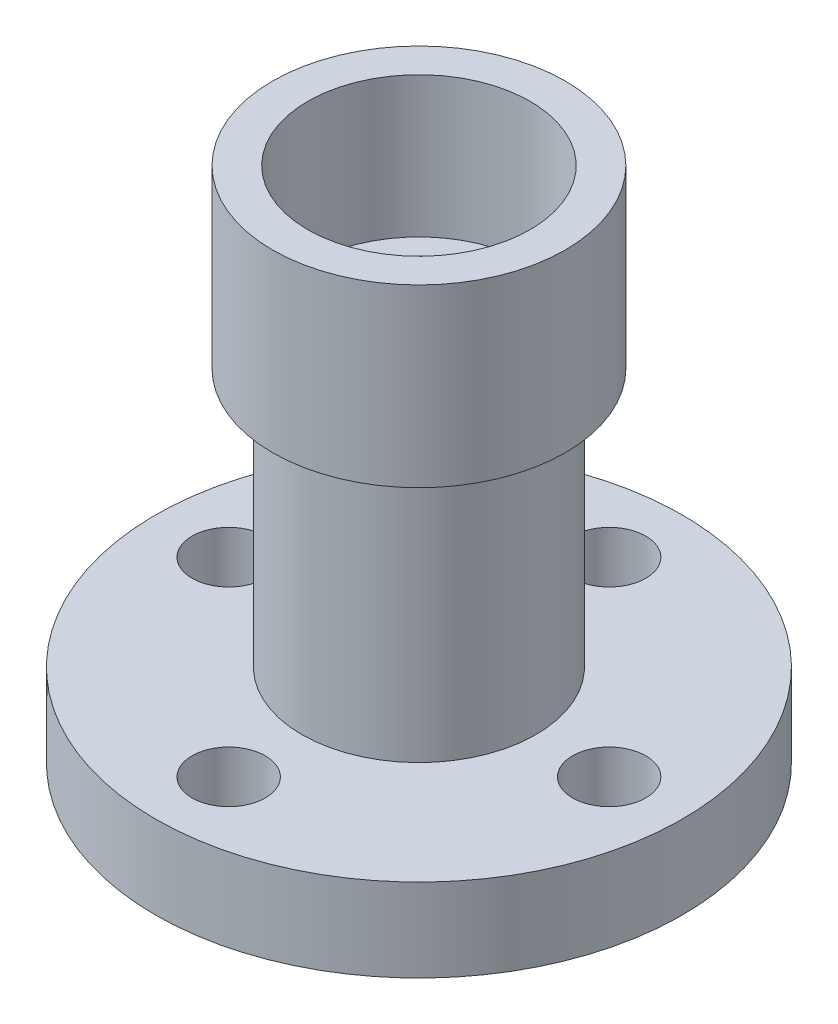
ISO-10303-21;
HEADER;
FILE_DESCRIPTION(('STEP AP214'),'2;1');
FILE_NAME('part.step','',(''),(''),'','','');
FILE_SCHEMA(('AUTOMOTIVE_DESIGN { 1 0 10303 214 1 1 1 1 }'));
ENDSEC;
DATA;
#1=APPLICATION_CONTEXT('core data for automotive mechanical design processes');
#2=APPLICATION_PROTOCOL_DEFINITION('international standard','automotive_design',2000,#1);
#3=PRODUCT_CONTEXT('',#1,'mechanical');
#4=PRODUCT('Part','Part','',(#3));
#5=PRODUCT_RELATED_PRODUCT_CATEGORY('part','',(#4));
#6=PRODUCT_DEFINITION_FORMATION('','',#4);
#7=PRODUCT_DEFINITION_CONTEXT('part definition',#1,'design');
#8=PRODUCT_DEFINITION('design','',#6,#7);
#9=PRODUCT_DEFINITION_SHAPE('','',#8);
#10=(LENGTH_UNIT() NAMED_UNIT(*) SI_UNIT(.MILLI.,.METRE.));
#11=(NAMED_UNIT(*) PLANE_ANGLE_UNIT() SI_UNIT($,.RADIAN.));
#12=(NAMED_UNIT(*) SI_UNIT($,.STERADIAN.) SOLID_ANGLE_UNIT());
#13=UNCERTAINTY_MEASURE_WITH_UNIT(LENGTH_MEASURE(1.E-05),#10,'distance_accuracy_value','');
#14=(GEOMETRIC_REPRESENTATION_CONTEXT(3) GLOBAL_UNCERTAINTY_ASSIGNED_CONTEXT((#13)) GLOBAL_UNIT_ASSIGNED_CONTEXT((#10,
#11,#12)) REPRESENTATION_CONTEXT('',''));
#15=CARTESIAN_POINT('',(0.,0.,0.));
#16=DIRECTION('',(0.,0.,1.));
#17=DIRECTION('',(1.,0.,0.));
#18=AXIS2_PLACEMENT_3D('',#15,#16,#17);
#19=CARTESIAN_POINT('',(0.,77.4,0.));
#20=DIRECTION('',(0.,-1.,0.));
#21=DIRECTION('',(0.,0.,-1.));
#22=AXIS2_PLACEMENT_3D('',#19,#20,#21);
#23=CYLINDRICAL_SURFACE('',#22,20.);
#24=CARTESIAN_POINT('',(0.,14.2,0.));
#25=DIRECTION('',(0.,1.,0.));
#26=DIRECTION('',(0.,0.,1.));
#27=AXIS2_PLACEMENT_3D('',#24,#25,#26);
#28=CIRCLE('',#27,20.);
#29=CARTESIAN_POINT('',(0.,14.2,20.));
#30=VERTEX_POINT('',#29);
#31=EDGE_CURVE('E73',#30,#30,#28,.F.);
#32=ORIENTED_EDGE('',*,*,#31,.F.);
#33=EDGE_LOOP('',(#32));
#34=FACE_BOUND('',#33,.T.);
#35=CARTESIAN_POINT('',(0.,58.4,0.));
#36=DIRECTION('',(0.,1.,0.));
#37=DIRECTION('',(0.,0.,1.));
#38=AXIS2_PLACEMENT_3D('',#35,#36,#37);
#39=CIRCLE('',#38,20.);
#40=CARTESIAN_POINT('',(0.,58.4,20.));
#41=VERTEX_POINT('',#40);
#42=EDGE_CURVE('E61',#41,#41,#39,.T.);
#43=ORIENTED_EDGE('',*,*,#42,.F.);
#44=EDGE_LOOP('',(#43));
#45=FACE_BOUND('',#44,.T.);
#46=ADVANCED_FACE('F47',(#34,#45),#23,.T.);
#47=CARTESIAN_POINT('',(0.,14.2,0.));
#48=DIRECTION('',(0.,-1.,0.));
#49=DIRECTION('',(0.,0.,-1.));
#50=AXIS2_PLACEMENT_3D('',#47,#48,#49);
#51=CYLINDRICAL_SURFACE('',#50,45.);
#52=CARTESIAN_POINT('',(0.,14.2,0.));
#53=DIRECTION('',(0.,1.,0.));
#54=DIRECTION('',(0.,0.,1.));
#55=AXIS2_PLACEMENT_3D('',#52,#53,#54);
#56=CIRCLE('',#55,45.);
#57=CARTESIAN_POINT('',(0.,14.2,45.));
#58=VERTEX_POINT('',#57);
#59=EDGE_CURVE('E66',#58,#58,#56,.T.);
#60=ORIENTED_EDGE('',*,*,#59,.F.);
#61=EDGE_LOOP('',(#60));
#62=FACE_BOUND('',#61,.T.);
#63=CARTESIAN_POINT('',(0.,0.,0.));
#64=DIRECTION('',(0.,1.,0.));
#65=DIRECTION('',(0.,0.,1.));
#66=AXIS2_PLACEMENT_3D('',#63,#64,#65);
#67=CIRCLE('',#66,45.);
#68=CARTESIAN_POINT('',(0.,0.,45.));
#69=VERTEX_POINT('',#68);
#70=EDGE_CURVE('E69',#69,#69,#67,.T.);
#71=ORIENTED_EDGE('',*,*,#70,.T.);
#72=EDGE_LOOP('',(#71));
#73=FACE_BOUND('',#72,.T.);
#74=ADVANCED_FACE('F146',(#62,#73),#51,.T.);
#75=CARTESIAN_POINT('',(0.,14.2,0.));
#76=DIRECTION('',(0.,1.,0.));
#77=DIRECTION('',(0.,0.,1.));
#78=AXIS2_PLACEMENT_3D('',#75,#76,#77);
#79=PLANE('',#78);
#80=CARTESIAN_POINT('',(0.,14.2,32.5));
#81=DIRECTION('',(0.,1.,0.));
#82=DIRECTION('',(0.,0.,1.));
#83=AXIS2_PLACEMENT_3D('',#80,#81,#82);
#84=CIRCLE('',#83,6.25);
#85=CARTESIAN_POINT('',(0.,14.2,38.75));
#86=VERTEX_POINT('',#85);
#87=EDGE_CURVE('E125',#86,#86,#84,.T.);
#88=ORIENTED_EDGE('',*,*,#87,.F.);
#89=EDGE_LOOP('',(#88));
#90=FACE_BOUND('',#89,.T.);
#91=CARTESIAN_POINT('',(-32.5,14.2,-1.1643193531908E-13));
#92=DIRECTION('',(0.,1.,0.));
#93=DIRECTION('',(0.,0.,1.));
#94=AXIS2_PLACEMENT_3D('',#91,#92,#93);
#95=CIRCLE('',#94,6.25);
#96=CARTESIAN_POINT('',(-32.5,14.2,6.24999999999989));
#97=VERTEX_POINT('',#96);
#98=EDGE_CURVE('E121',#97,#97,#95,.T.);
#99=ORIENTED_EDGE('',*,*,#98,.F.);
#100=EDGE_LOOP('',(#99));
#101=FACE_BOUND('',#100,.T.);
#102=CARTESIAN_POINT('',(2.22966184927575E-13,14.2,-32.5));
#103=DIRECTION('',(0.,1.,0.));
#104=DIRECTION('',(0.,0.,1.));
#105=AXIS2_PLACEMENT_3D('',#102,#103,#104);
#106=CIRCLE('',#105,6.25);
#107=CARTESIAN_POINT('',(2.22966184927575E-13,14.2,-26.25));
#108=VERTEX_POINT('',#107);
#109=EDGE_CURVE('E113',#108,#108,#106,.T.);
#110=ORIENTED_EDGE('',*,*,#109,.F.);
#111=EDGE_LOOP('',(#110));
#112=FACE_BOUND('',#111,.T.);
#113=CARTESIAN_POINT('',(32.5,14.2,3.36439328439977E-13));
#114=DIRECTION('',(0.,1.,0.));
#115=DIRECTION('',(0.,0.,1.));
#116=AXIS2_PLACEMENT_3D('',#113,#114,#115);
#117=CIRCLE('',#116,6.25);
#118=CARTESIAN_POINT('',(32.5,14.2,6.25000000000034));
#119=VERTEX_POINT('',#118);
#120=EDGE_CURVE('E105',#119,#119,#117,.T.);
#121=ORIENTED_EDGE('',*,*,#120,.F.);
#122=EDGE_LOOP('',(#121));
#123=FACE_BOUND('',#122,.T.);
#124=ORIENTED_EDGE('',*,*,#31,.T.);
#125=EDGE_LOOP('',(#124));
#126=FACE_BOUND('',#125,.T.);
#127=ORIENTED_EDGE('',*,*,#59,.T.);
#128=EDGE_LOOP('',(#127));
#129=FACE_BOUND('',#128,.T.);
#130=ADVANCED_FACE('F143',(#90,#101,#112,#123,#126,#129),#79,.T.);
#131=CARTESIAN_POINT('',(0.,0.,0.));
#132=DIRECTION('',(0.,1.,0.));
#133=DIRECTION('',(0.,0.,1.));
#134=AXIS2_PLACEMENT_3D('',#131,#132,#133);
#135=PLANE('',#134);
#136=CARTESIAN_POINT('',(0.,0.,32.5));
#137=DIRECTION('',(0.,1.,0.));
#138=DIRECTION('',(0.,0.,1.));
#139=AXIS2_PLACEMENT_3D('',#136,#137,#138);
#140=CIRCLE('',#139,6.25);
#141=CARTESIAN_POINT('',(0.,0.,38.75));
#142=VERTEX_POINT('',#141);
#143=EDGE_CURVE('E97',#142,#142,#140,.T.);
#144=ORIENTED_EDGE('',*,*,#143,.T.);
#145=EDGE_LOOP('',(#144));
#146=FACE_BOUND('',#145,.T.);
#147=CARTESIAN_POINT('',(-32.5,0.,-1.1643193531908E-13));
#148=DIRECTION('',(0.,1.,0.));
#149=DIRECTION('',(0.,0.,1.));
#150=AXIS2_PLACEMENT_3D('',#147,#148,#149);
#151=CIRCLE('',#150,6.25);
#152=CARTESIAN_POINT('',(-32.5,0.,6.24999999999989));
#153=VERTEX_POINT('',#152);
#154=EDGE_CURVE('E117',#153,#153,#151,.T.);
#155=ORIENTED_EDGE('',*,*,#154,.T.);
#156=EDGE_LOOP('',(#155));
#157=FACE_BOUND('',#156,.T.);
#158=CARTESIAN_POINT('',(2.22966184927575E-13,0.,-32.5));
#159=DIRECTION('',(0.,1.,0.));
#160=DIRECTION('',(0.,0.,1.));
#161=AXIS2_PLACEMENT_3D('',#158,#159,#160);
#162=CIRCLE('',#161,6.25);
#163=CARTESIAN_POINT('',(2.22966184927575E-13,0.,-26.25));
#164=VERTEX_POINT('',#163);
#165=EDGE_CURVE('E109',#164,#164,#162,.T.);
#166=ORIENTED_EDGE('',*,*,#165,.T.);
#167=EDGE_LOOP('',(#166));
#168=FACE_BOUND('',#167,.T.);
#169=CARTESIAN_POINT('',(32.5,0.,3.36439328439977E-13));
#170=DIRECTION('',(0.,1.,0.));
#171=DIRECTION('',(0.,0.,1.));
#172=AXIS2_PLACEMENT_3D('',#169,#170,#171);
#173=CIRCLE('',#172,6.25);
#174=CARTESIAN_POINT('',(32.5,0.,6.25000000000034));
#175=VERTEX_POINT('',#174);
#176=EDGE_CURVE('E101',#175,#175,#173,.T.);
#177=ORIENTED_EDGE('',*,*,#176,.T.);
#178=EDGE_LOOP('',(#177));
#179=FACE_BOUND('',#178,.T.);
#180=CARTESIAN_POINT('',(0.,0.,0.));
#181=DIRECTION('',(0.,1.,0.));
#182=DIRECTION('',(0.,0.,1.));
#183=AXIS2_PLACEMENT_3D('',#180,#181,#182);
#184=CIRCLE('',#183,18.5);
#185=CARTESIAN_POINT('',(0.,0.,18.5));
#186=VERTEX_POINT('',#185);
#187=EDGE_CURVE('E56',#186,#186,#184,.T.);
#188=ORIENTED_EDGE('',*,*,#187,.T.);
#189=EDGE_LOOP('',(#188));
#190=FACE_BOUND('',#189,.T.);
#191=ORIENTED_EDGE('',*,*,#70,.F.);
#192=EDGE_LOOP('',(#191));
#193=FACE_BOUND('',#192,.T.);
#194=ADVANCED_FACE('F133',(#146,#157,#168,#179,#190,#193),#135,.F.);
#195=CARTESIAN_POINT('',(0.,88.4,0.));
#196=DIRECTION('',(0.,-1.,0.));
#197=DIRECTION('',(0.,0.,-1.));
#198=AXIS2_PLACEMENT_3D('',#195,#196,#197);
#199=CYLINDRICAL_SURFACE('',#198,25.);
#200=CARTESIAN_POINT('',(0.,88.4,0.));
#201=DIRECTION('',(0.,1.,0.));
#202=DIRECTION('',(0.,0.,1.));
#203=AXIS2_PLACEMENT_3D('',#200,#201,#202);
#204=CIRCLE('',#203,25.);
#205=CARTESIAN_POINT('',(0.,88.4,25.));
#206=VERTEX_POINT('',#205);
#207=EDGE_CURVE('E80',#206,#206,#204,.T.);
#208=ORIENTED_EDGE('',*,*,#207,.F.);
#209=EDGE_LOOP('',(#208));
#210=FACE_BOUND('',#209,.T.);
#211=CARTESIAN_POINT('',(0.,58.4,0.));
#212=DIRECTION('',(0.,1.,0.));
#213=DIRECTION('',(0.,0.,1.));
#214=AXIS2_PLACEMENT_3D('',#211,#212,#213);
#215=CIRCLE('',#214,25.);
#216=CARTESIAN_POINT('',(0.,58.4,25.));
#217=VERTEX_POINT('',#216);
#218=EDGE_CURVE('E81',#217,#217,#215,.T.);
#219=ORIENTED_EDGE('',*,*,#218,.T.);
#220=EDGE_LOOP('',(#219));
#221=FACE_BOUND('',#220,.T.);
#222=ADVANCED_FACE('F163',(#210,#221),#199,.T.);
#223=CARTESIAN_POINT('',(0.,88.4,0.));
#224=DIRECTION('',(0.,1.,0.));
#225=DIRECTION('',(0.,0.,1.));
#226=AXIS2_PLACEMENT_3D('',#223,#224,#225);
#227=PLANE('',#226);
#228=CARTESIAN_POINT('',(0.,88.4,0.));
#229=DIRECTION('',(0.,1.,0.));
#230=DIRECTION('',(0.,0.,1.));
#231=AXIS2_PLACEMENT_3D('',#228,#229,#230);
#232=CIRCLE('',#231,19.);
#233=CARTESIAN_POINT('',(0.,88.4,19.));
#234=VERTEX_POINT('',#233);
#235=EDGE_CURVE('E93',#234,#234,#232,.T.);
#236=ORIENTED_EDGE('',*,*,#235,.F.);
#237=EDGE_LOOP('',(#236));
#238=FACE_BOUND('',#237,.T.);
#239=ORIENTED_EDGE('',*,*,#207,.T.);
#240=EDGE_LOOP('',(#239));
#241=FACE_BOUND('',#240,.T.);
#242=ADVANCED_FACE('F169',(#238,#241),#227,.T.);
#243=CARTESIAN_POINT('',(0.,58.4,0.));
#244=DIRECTION('',(0.,1.,0.));
#245=DIRECTION('',(0.,0.,1.));
#246=AXIS2_PLACEMENT_3D('',#243,#244,#245);
#247=PLANE('',#246);
#248=ORIENTED_EDGE('',*,*,#42,.T.);
#249=EDGE_LOOP('',(#248));
#250=FACE_BOUND('',#249,.T.);
#251=ORIENTED_EDGE('',*,*,#218,.F.);
#252=EDGE_LOOP('',(#251));
#253=FACE_BOUND('',#252,.T.);
#254=ADVANCED_FACE('F179',(#250,#253),#247,.F.);
#255=CARTESIAN_POINT('',(0.,64.4,0.));
#256=DIRECTION('',(0.,-1.,0.));
#257=DIRECTION('',(0.,0.,-1.));
#258=AXIS2_PLACEMENT_3D('',#255,#256,#257);
#259=CYLINDRICAL_SURFACE('',#258,15.);
#260=CARTESIAN_POINT('',(0.,3.00000000000003,0.));
#261=DIRECTION('',(0.,1.,0.));
#262=DIRECTION('',(0.,0.,1.));
#263=AXIS2_PLACEMENT_3D('',#260,#261,#262);
#264=CIRCLE('',#263,15.);
#265=CARTESIAN_POINT('',(0.,3.00000000000003,15.));
#266=VERTEX_POINT('',#265);
#267=EDGE_CURVE('E10',#266,#266,#264,.F.);
#268=ORIENTED_EDGE('',*,*,#267,.T.);
#269=EDGE_LOOP('',(#268));
#270=FACE_BOUND('',#269,.T.);
#271=CARTESIAN_POINT('',(0.,64.4,0.));
#272=DIRECTION('',(0.,1.,0.));
#273=DIRECTION('',(0.,0.,1.));
#274=AXIS2_PLACEMENT_3D('',#271,#272,#273);
#275=CIRCLE('',#274,15.);
#276=CARTESIAN_POINT('',(0.,64.4,15.));
#277=VERTEX_POINT('',#276);
#278=EDGE_CURVE('E85',#277,#277,#275,.T.);
#279=ORIENTED_EDGE('',*,*,#278,.T.);
#280=EDGE_LOOP('',(#279));
#281=FACE_BOUND('',#280,.T.);
#282=ADVANCED_FACE('F182',(#270,#281),#259,.F.);
#283=CARTESIAN_POINT('',(0.,0.,0.));
#284=DIRECTION('',(0.,-1.,0.));
#285=DIRECTION('',(0.,0.,-1.));
#286=AXIS2_PLACEMENT_3D('',#283,#284,#285);
#287=CONICAL_SURFACE('',#286,18.5,0.862170054667226);
#288=ORIENTED_EDGE('',*,*,#267,.F.);
#289=EDGE_LOOP('',(#288));
#290=FACE_BOUND('',#289,.T.);
#291=ORIENTED_EDGE('',*,*,#187,.F.);
#292=EDGE_LOOP('',(#291));
#293=FACE_BOUND('',#292,.T.);
#294=ADVANCED_FACE('F50',(#290,#293),#287,.F.);
#295=CARTESIAN_POINT('',(0.,64.4,0.));
#296=DIRECTION('',(0.,1.,0.));
#297=DIRECTION('',(0.,0.,1.));
#298=AXIS2_PLACEMENT_3D('',#295,#296,#297);
#299=CYLINDRICAL_SURFACE('',#298,19.);
#300=CARTESIAN_POINT('',(0.,64.4,0.));
#301=DIRECTION('',(0.,1.,0.));
#302=DIRECTION('',(0.,0.,1.));
#303=AXIS2_PLACEMENT_3D('',#300,#301,#302);
#304=CIRCLE('',#303,19.);
#305=CARTESIAN_POINT('',(0.,64.4,19.));
#306=VERTEX_POINT('',#305);
#307=EDGE_CURVE('E92',#306,#306,#304,.T.);
#308=ORIENTED_EDGE('',*,*,#307,.F.);
#309=EDGE_LOOP('',(#308));
#310=FACE_BOUND('',#309,.T.);
#311=ORIENTED_EDGE('',*,*,#235,.T.);
#312=EDGE_LOOP('',(#311));
#313=FACE_BOUND('',#312,.T.);
#314=ADVANCED_FACE('F189',(#310,#313),#299,.F.);
#315=CARTESIAN_POINT('',(0.,64.4,0.));
#316=DIRECTION('',(0.,1.,0.));
#317=DIRECTION('',(0.,0.,1.));
#318=AXIS2_PLACEMENT_3D('',#315,#316,#317);
#319=PLANE('',#318);
#320=ORIENTED_EDGE('',*,*,#278,.F.);
#321=EDGE_LOOP('',(#320));
#322=FACE_BOUND('',#321,.T.);
#323=ORIENTED_EDGE('',*,*,#307,.T.);
#324=EDGE_LOOP('',(#323));
#325=FACE_BOUND('',#324,.T.);
#326=ADVANCED_FACE('F192',(#322,#325),#319,.T.);
#327=CARTESIAN_POINT('',(32.5,0.,3.36439328439977E-13));
#328=DIRECTION('',(0.,1.,0.));
#329=DIRECTION('',(0.,0.,1.));
#330=AXIS2_PLACEMENT_3D('',#327,#328,#329);
#331=CYLINDRICAL_SURFACE('',#330,6.25);
#332=ORIENTED_EDGE('',*,*,#176,.F.);
#333=EDGE_LOOP('',(#332));
#334=FACE_BOUND('',#333,.T.);
#335=ORIENTED_EDGE('',*,*,#120,.T.);
#336=EDGE_LOOP('',(#335));
#337=FACE_BOUND('',#336,.T.);
#338=ADVANCED_FACE('F196',(#334,#337),#331,.F.);
#339=CARTESIAN_POINT('',(2.22966184927575E-13,0.,-32.5));
#340=DIRECTION('',(0.,1.,0.));
#341=DIRECTION('',(0.,0.,1.));
#342=AXIS2_PLACEMENT_3D('',#339,#340,#341);
#343=CYLINDRICAL_SURFACE('',#342,6.25);
#344=ORIENTED_EDGE('',*,*,#165,.F.);
#345=EDGE_LOOP('',(#344));
#346=FACE_BOUND('',#345,.T.);
#347=ORIENTED_EDGE('',*,*,#109,.T.);
#348=EDGE_LOOP('',(#347));
#349=FACE_BOUND('',#348,.T.);
#350=ADVANCED_FACE('F199',(#346,#349),#343,.F.);
#351=CARTESIAN_POINT('',(-32.5,0.,-1.1643193531908E-13));
#352=DIRECTION('',(0.,1.,0.));
#353=DIRECTION('',(0.,0.,1.));
#354=AXIS2_PLACEMENT_3D('',#351,#352,#353);
#355=CYLINDRICAL_SURFACE('',#354,6.25);
#356=ORIENTED_EDGE('',*,*,#154,.F.);
#357=EDGE_LOOP('',(#356));
#358=FACE_BOUND('',#357,.T.);
#359=ORIENTED_EDGE('',*,*,#98,.T.);
#360=EDGE_LOOP('',(#359));
#361=FACE_BOUND('',#360,.T.);
#362=ADVANCED_FACE('F139',(#358,#361),#355,.F.);
#363=CARTESIAN_POINT('',(0.,0.,32.5));
#364=DIRECTION('',(0.,1.,0.));
#365=DIRECTION('',(0.,0.,1.));
#366=AXIS2_PLACEMENT_3D('',#363,#364,#365);
#367=CYLINDRICAL_SURFACE('',#366,6.25);
#368=ORIENTED_EDGE('',*,*,#143,.F.);
#369=EDGE_LOOP('',(#368));
#370=FACE_BOUND('',#369,.T.);
#371=ORIENTED_EDGE('',*,*,#87,.T.);
#372=EDGE_LOOP('',(#371));
#373=FACE_BOUND('',#372,.T.);
#374=ADVANCED_FACE('F136',(#370,#373),#367,.F.);
#375=CLOSED_SHELL('',(#46,#74,#130,#194,#222,#242,#254,#282,#294,#314,#326,#338,#350,#362,#374));
#376=MANIFOLD_SOLID_BREP('B2',#375);
#377=ADVANCED_BREP_SHAPE_REPRESENTATION('',(#18,#376),#14);
#378=SHAPE_DEFINITION_REPRESENTATION(#9,#377);
ENDSEC;
END-ISO-10303-21;
